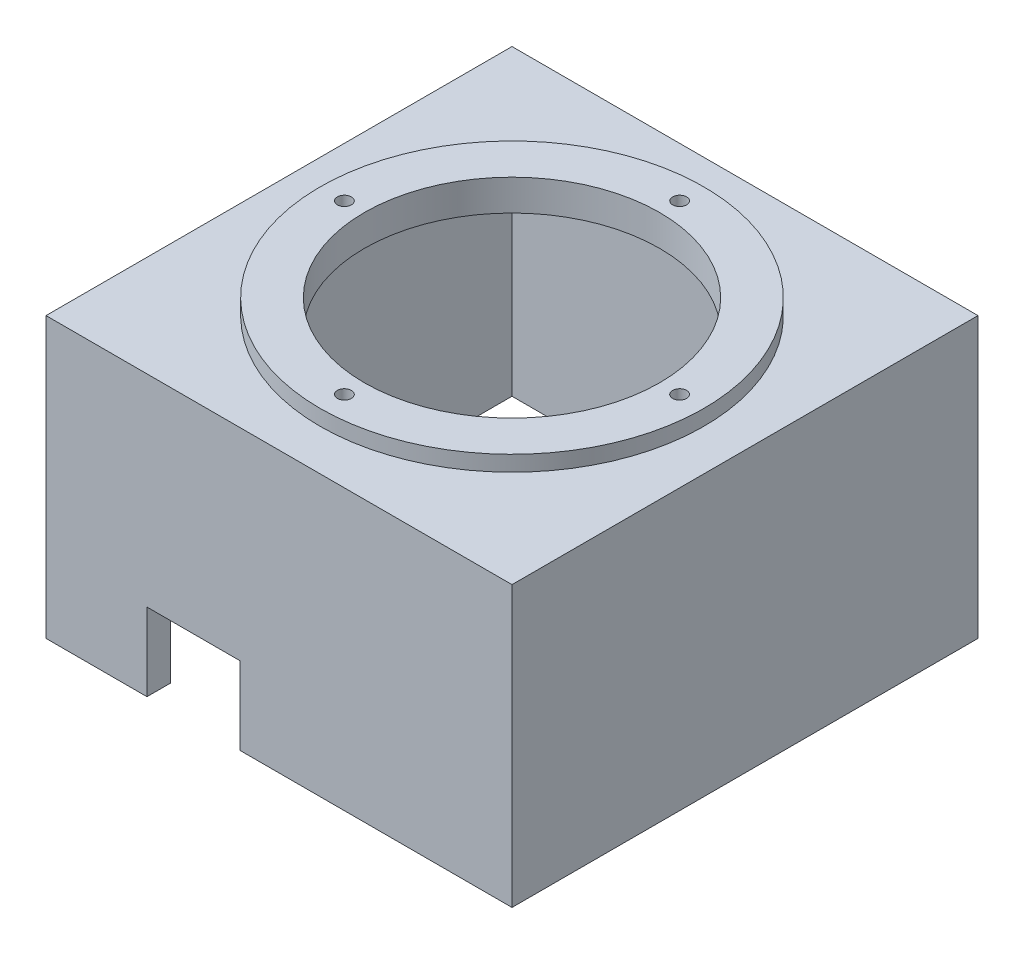
ISO-10303-21;
HEADER;
FILE_DESCRIPTION(('STEP AP214'),'2;1');
FILE_NAME('part.step','',(''),(''),'','','');
FILE_SCHEMA(('AUTOMOTIVE_DESIGN { 1 0 10303 214 1 1 1 1 }'));
ENDSEC;
DATA;
#1=APPLICATION_CONTEXT('core data for automotive mechanical design processes');
#2=APPLICATION_PROTOCOL_DEFINITION('international standard','automotive_design',2000,#1);
#3=PRODUCT_CONTEXT('',#1,'mechanical');
#4=PRODUCT('Part','Part','',(#3));
#5=PRODUCT_RELATED_PRODUCT_CATEGORY('part','',(#4));
#6=PRODUCT_DEFINITION_FORMATION('','',#4);
#7=PRODUCT_DEFINITION_CONTEXT('part definition',#1,'design');
#8=PRODUCT_DEFINITION('design','',#6,#7);
#9=PRODUCT_DEFINITION_SHAPE('','',#8);
#10=(LENGTH_UNIT() NAMED_UNIT(*) SI_UNIT(.MILLI.,.METRE.));
#11=(NAMED_UNIT(*) PLANE_ANGLE_UNIT() SI_UNIT($,.RADIAN.));
#12=(NAMED_UNIT(*) SI_UNIT($,.STERADIAN.) SOLID_ANGLE_UNIT());
#13=UNCERTAINTY_MEASURE_WITH_UNIT(LENGTH_MEASURE(1.E-05),#10,'distance_accuracy_value','');
#14=(GEOMETRIC_REPRESENTATION_CONTEXT(3) GLOBAL_UNCERTAINTY_ASSIGNED_CONTEXT((#13)) GLOBAL_UNIT_ASSIGNED_CONTEXT((#10,
#11,#12)) REPRESENTATION_CONTEXT('',''));
#15=CARTESIAN_POINT('',(0.,0.,0.));
#16=DIRECTION('',(0.,0.,1.));
#17=DIRECTION('',(1.,0.,0.));
#18=AXIS2_PLACEMENT_3D('',#15,#16,#17);
#19=CARTESIAN_POINT('',(0.,5.,0.));
#20=DIRECTION('',(0.,-1.,0.));
#21=DIRECTION('',(0.,0.,-1.));
#22=AXIS2_PLACEMENT_3D('',#19,#20,#21);
#23=CYLINDRICAL_SURFACE('',#22,47.5);
#24=CARTESIAN_POINT('',(0.,5.,0.));
#25=DIRECTION('',(0.,1.,0.));
#26=DIRECTION('',(0.,0.,1.));
#27=AXIS2_PLACEMENT_3D('',#24,#25,#26);
#28=CIRCLE('',#27,47.5);
#29=CARTESIAN_POINT('',(0.,5.,47.5));
#30=VERTEX_POINT('',#29);
#31=EDGE_CURVE('E323',#30,#30,#28,.T.);
#32=ORIENTED_EDGE('',*,*,#31,.T.);
#33=EDGE_LOOP('',(#32));
#34=FACE_BOUND('',#33,.T.);
#35=CARTESIAN_POINT('',(0.,-4.99999999999999,0.));
#36=DIRECTION('',(0.,-1.,0.));
#37=DIRECTION('',(0.,0.,-1.));
#38=AXIS2_PLACEMENT_3D('',#35,#36,#37);
#39=CIRCLE('',#38,47.5);
#40=CARTESIAN_POINT('',(0.,-4.99999999999999,-47.5));
#41=VERTEX_POINT('',#40);
#42=EDGE_CURVE('E241',#41,#41,#39,.T.);
#43=ORIENTED_EDGE('',*,*,#42,.T.);
#44=EDGE_LOOP('',(#43));
#45=FACE_BOUND('',#44,.T.);
#46=ADVANCED_FACE('F78',(#34,#45),#23,.F.);
#47=CARTESIAN_POINT('',(-53.95,-4.5,0.));
#48=DIRECTION('',(0.,1.,0.));
#49=DIRECTION('',(0.,0.,1.));
#50=AXIS2_PLACEMENT_3D('',#47,#48,#49);
#51=CYLINDRICAL_SURFACE('',#50,2.25);
#52=CARTESIAN_POINT('',(-53.95,5.,0.));
#53=DIRECTION('',(0.,1.,0.));
#54=DIRECTION('',(0.,0.,-1.));
#55=AXIS2_PLACEMENT_3D('',#52,#53,#54);
#56=CIRCLE('',#55,2.25);
#57=CARTESIAN_POINT('',(-53.95,5.,-2.24999999999999));
#58=VERTEX_POINT('',#57);
#59=EDGE_CURVE('E332',#58,#58,#56,.T.);
#60=ORIENTED_EDGE('',*,*,#59,.T.);
#61=EDGE_LOOP('',(#60));
#62=FACE_BOUND('',#61,.T.);
#63=CARTESIAN_POINT('',(-53.95,-4.99999999999999,0.));
#64=DIRECTION('',(0.,-1.,0.));
#65=DIRECTION('',(0.,0.,-1.));
#66=AXIS2_PLACEMENT_3D('',#63,#64,#65);
#67=CIRCLE('',#66,2.25);
#68=CARTESIAN_POINT('',(-53.95,-4.99999999999999,-2.24999999999999));
#69=VERTEX_POINT('',#68);
#70=EDGE_CURVE('E237',#69,#69,#67,.F.);
#71=ORIENTED_EDGE('',*,*,#70,.F.);
#72=EDGE_LOOP('',(#71));
#73=FACE_BOUND('',#72,.T.);
#74=ADVANCED_FACE('F391',(#62,#73),#51,.F.);
#75=CARTESIAN_POINT('',(53.95,-4.5,0.));
#76=DIRECTION('',(0.,1.,0.));
#77=DIRECTION('',(0.,0.,1.));
#78=AXIS2_PLACEMENT_3D('',#75,#76,#77);
#79=CYLINDRICAL_SURFACE('',#78,2.25);
#80=CARTESIAN_POINT('',(53.95,5.,0.));
#81=DIRECTION('',(0.,1.,0.));
#82=DIRECTION('',(0.,0.,1.));
#83=AXIS2_PLACEMENT_3D('',#80,#81,#82);
#84=CIRCLE('',#83,2.25);
#85=CARTESIAN_POINT('',(53.95,5.,2.25));
#86=VERTEX_POINT('',#85);
#87=EDGE_CURVE('E328',#86,#86,#84,.T.);
#88=ORIENTED_EDGE('',*,*,#87,.T.);
#89=EDGE_LOOP('',(#88));
#90=FACE_BOUND('',#89,.T.);
#91=CARTESIAN_POINT('',(53.95,-4.99999999999999,0.));
#92=DIRECTION('',(0.,-1.,0.));
#93=DIRECTION('',(0.,0.,-1.));
#94=AXIS2_PLACEMENT_3D('',#91,#92,#93);
#95=CIRCLE('',#94,2.25);
#96=CARTESIAN_POINT('',(53.95,-4.99999999999999,-2.25));
#97=VERTEX_POINT('',#96);
#98=EDGE_CURVE('E233',#97,#97,#95,.F.);
#99=ORIENTED_EDGE('',*,*,#98,.F.);
#100=EDGE_LOOP('',(#99));
#101=FACE_BOUND('',#100,.T.);
#102=ADVANCED_FACE('F398',(#90,#101),#79,.F.);
#103=CARTESIAN_POINT('',(0.,-4.5,53.95));
#104=DIRECTION('',(0.,1.,0.));
#105=DIRECTION('',(0.,0.,1.));
#106=AXIS2_PLACEMENT_3D('',#103,#104,#105);
#107=CYLINDRICAL_SURFACE('',#106,2.25);
#108=CARTESIAN_POINT('',(0.,5.,53.95));
#109=DIRECTION('',(0.,1.,0.));
#110=DIRECTION('',(0.,0.,-1.));
#111=AXIS2_PLACEMENT_3D('',#108,#109,#110);
#112=CIRCLE('',#111,2.25);
#113=CARTESIAN_POINT('',(0.,5.,51.7));
#114=VERTEX_POINT('',#113);
#115=EDGE_CURVE('E324',#114,#114,#112,.T.);
#116=ORIENTED_EDGE('',*,*,#115,.T.);
#117=EDGE_LOOP('',(#116));
#118=FACE_BOUND('',#117,.T.);
#119=CARTESIAN_POINT('',(0.,-4.99999999999999,53.95));
#120=DIRECTION('',(0.,-1.,0.));
#121=DIRECTION('',(0.,0.,-1.));
#122=AXIS2_PLACEMENT_3D('',#119,#120,#121);
#123=CIRCLE('',#122,2.25);
#124=CARTESIAN_POINT('',(0.,-4.99999999999999,51.7));
#125=VERTEX_POINT('',#124);
#126=EDGE_CURVE('E229',#125,#125,#123,.F.);
#127=ORIENTED_EDGE('',*,*,#126,.F.);
#128=EDGE_LOOP('',(#127));
#129=FACE_BOUND('',#128,.T.);
#130=ADVANCED_FACE('F413',(#118,#129),#107,.F.);
#131=CARTESIAN_POINT('',(0.,-4.5,-53.95));
#132=DIRECTION('',(0.,1.,0.));
#133=DIRECTION('',(0.,0.,1.));
#134=AXIS2_PLACEMENT_3D('',#131,#132,#133);
#135=CYLINDRICAL_SURFACE('',#134,2.25);
#136=CARTESIAN_POINT('',(0.,5.,-53.95));
#137=DIRECTION('',(0.,1.,0.));
#138=DIRECTION('',(0.,0.,1.));
#139=AXIS2_PLACEMENT_3D('',#136,#137,#138);
#140=CIRCLE('',#139,2.25);
#141=CARTESIAN_POINT('',(0.,5.,-51.7));
#142=VERTEX_POINT('',#141);
#143=EDGE_CURVE('E319',#142,#142,#140,.T.);
#144=ORIENTED_EDGE('',*,*,#143,.T.);
#145=EDGE_LOOP('',(#144));
#146=FACE_BOUND('',#145,.T.);
#147=CARTESIAN_POINT('',(0.,-4.99999999999999,-53.95));
#148=DIRECTION('',(0.,-1.,0.));
#149=DIRECTION('',(0.,0.,-1.));
#150=AXIS2_PLACEMENT_3D('',#147,#148,#149);
#151=CIRCLE('',#150,2.25);
#152=CARTESIAN_POINT('',(0.,-4.99999999999999,-56.2));
#153=VERTEX_POINT('',#152);
#154=EDGE_CURVE('E82',#153,#153,#151,.F.);
#155=ORIENTED_EDGE('',*,*,#154,.F.);
#156=EDGE_LOOP('',(#155));
#157=FACE_BOUND('',#156,.T.);
#158=ADVANCED_FACE('F405',(#146,#157),#135,.F.);
#159=CARTESIAN_POINT('',(0.,5.,0.));
#160=DIRECTION('',(0.,1.,0.));
#161=DIRECTION('',(0.,0.,1.));
#162=AXIS2_PLACEMENT_3D('',#159,#160,#161);
#163=PLANE('',#162);
#164=ORIENTED_EDGE('',*,*,#143,.F.);
#165=EDGE_LOOP('',(#164));
#166=FACE_BOUND('',#165,.T.);
#167=ORIENTED_EDGE('',*,*,#115,.F.);
#168=EDGE_LOOP('',(#167));
#169=FACE_BOUND('',#168,.T.);
#170=ORIENTED_EDGE('',*,*,#87,.F.);
#171=EDGE_LOOP('',(#170));
#172=FACE_BOUND('',#171,.T.);
#173=ORIENTED_EDGE('',*,*,#59,.F.);
#174=EDGE_LOOP('',(#173));
#175=FACE_BOUND('',#174,.T.);
#176=CARTESIAN_POINT('',(0.,5.,0.));
#177=DIRECTION('',(0.,1.,0.));
#178=DIRECTION('',(0.,0.,1.));
#179=AXIS2_PLACEMENT_3D('',#176,#177,#178);
#180=CIRCLE('',#179,61.7650829549725);
#181=CARTESIAN_POINT('',(0.,5.,61.7650829549725));
#182=VERTEX_POINT('',#181);
#183=EDGE_CURVE('E339',#182,#182,#180,.T.);
#184=ORIENTED_EDGE('',*,*,#183,.T.);
#185=EDGE_LOOP('',(#184));
#186=FACE_BOUND('',#185,.T.);
#187=ORIENTED_EDGE('',*,*,#31,.F.);
#188=EDGE_LOOP('',(#187));
#189=FACE_BOUND('',#188,.T.);
#190=ADVANCED_FACE('F403',(#166,#169,#172,#175,#186,#189),#163,.T.);
#191=CARTESIAN_POINT('',(0.,5.,0.));
#192=DIRECTION('',(0.,-1.,0.));
#193=DIRECTION('',(0.,0.,-1.));
#194=AXIS2_PLACEMENT_3D('',#191,#192,#193);
#195=CYLINDRICAL_SURFACE('',#194,61.7650829549725);
#196=ORIENTED_EDGE('',*,*,#183,.F.);
#197=EDGE_LOOP('',(#196));
#198=FACE_BOUND('',#197,.T.);
#199=CARTESIAN_POINT('',(0.,0.,0.));
#200=DIRECTION('',(0.,1.,0.));
#201=DIRECTION('',(0.,0.,1.));
#202=AXIS2_PLACEMENT_3D('',#199,#200,#201);
#203=CIRCLE('',#202,61.7650829549725);
#204=CARTESIAN_POINT('',(0.,0.,61.7650829549725));
#205=VERTEX_POINT('',#204);
#206=EDGE_CURVE('E318',#205,#205,#203,.T.);
#207=ORIENTED_EDGE('',*,*,#206,.T.);
#208=EDGE_LOOP('',(#207));
#209=FACE_BOUND('',#208,.T.);
#210=ADVANCED_FACE('F80',(#198,#209),#195,.T.);
#211=CARTESIAN_POINT('',(0.,-90.,0.));
#212=DIRECTION('',(0.,-1.,0.));
#213=DIRECTION('',(0.,0.,-1.));
#214=AXIS2_PLACEMENT_3D('',#211,#212,#213);
#215=PLANE('',#214);
#216=DIRECTION('',(-1.,0.,0.));
#217=VECTOR('',#216,1.);
#218=CARTESIAN_POINT('',(-67.5,-90.,67.5));
#219=LINE('',#218,#217);
#220=CARTESIAN_POINT('',(67.5,-90.,67.5));
#221=VERTEX_POINT('',#220);
#222=CARTESIAN_POINT('',(-12.5,-90.,67.5));
#223=VERTEX_POINT('',#222);
#224=EDGE_CURVE('E95',#221,#223,#219,.T.);
#225=ORIENTED_EDGE('',*,*,#224,.F.);
#226=DIRECTION('',(0.,0.,1.));
#227=VECTOR('',#226,1.);
#228=CARTESIAN_POINT('',(67.5,-90.,67.5));
#229=LINE('',#228,#227);
#230=CARTESIAN_POINT('',(67.5,-90.,-67.5));
#231=VERTEX_POINT('',#230);
#232=EDGE_CURVE('E175',#231,#221,#229,.T.);
#233=ORIENTED_EDGE('',*,*,#232,.F.);
#234=DIRECTION('',(1.,0.,0.));
#235=VECTOR('',#234,1.);
#236=CARTESIAN_POINT('',(-67.5,-90.,-67.5));
#237=LINE('',#236,#235);
#238=CARTESIAN_POINT('',(-67.5,-90.,-67.5));
#239=VERTEX_POINT('',#238);
#240=EDGE_CURVE('E194',#239,#231,#237,.T.);
#241=ORIENTED_EDGE('',*,*,#240,.F.);
#242=DIRECTION('',(0.,0.,-1.));
#243=VECTOR('',#242,1.);
#244=CARTESIAN_POINT('',(-67.5,-90.,67.5));
#245=LINE('',#244,#243);
#246=CARTESIAN_POINT('',(-67.5,-90.,67.5));
#247=VERTEX_POINT('',#246);
#248=EDGE_CURVE('E198',#247,#239,#245,.T.);
#249=ORIENTED_EDGE('',*,*,#248,.F.);
#250=CARTESIAN_POINT('',(-42.5,-90.,67.5));
#251=VERTEX_POINT('',#250);
#252=EDGE_CURVE('E207',#251,#247,#219,.T.);
#253=ORIENTED_EDGE('',*,*,#252,.F.);
#254=DIRECTION('',(0.,0.,-1.));
#255=VECTOR('',#254,1.);
#256=CARTESIAN_POINT('',(-42.5,-90.,0.));
#257=LINE('',#256,#255);
#258=CARTESIAN_POINT('',(-42.5,-90.,75.));
#259=VERTEX_POINT('',#258);
#260=EDGE_CURVE('E270',#259,#251,#257,.T.);
#261=ORIENTED_EDGE('',*,*,#260,.F.);
#262=DIRECTION('',(-1.,0.,0.));
#263=VECTOR('',#262,1.);
#264=CARTESIAN_POINT('',(-75.,-90.,75.));
#265=LINE('',#264,#263);
#266=CARTESIAN_POINT('',(-75.,-90.,75.));
#267=VERTEX_POINT('',#266);
#268=EDGE_CURVE('E279',#259,#267,#265,.T.);
#269=ORIENTED_EDGE('',*,*,#268,.T.);
#270=DIRECTION('',(0.,0.,-1.));
#271=VECTOR('',#270,1.);
#272=CARTESIAN_POINT('',(-75.,-90.,75.));
#273=LINE('',#272,#271);
#274=CARTESIAN_POINT('',(-75.,-90.,-75.));
#275=VERTEX_POINT('',#274);
#276=EDGE_CURVE('E285',#267,#275,#273,.T.);
#277=ORIENTED_EDGE('',*,*,#276,.T.);
#278=DIRECTION('',(1.,0.,0.));
#279=VECTOR('',#278,1.);
#280=CARTESIAN_POINT('',(-75.,-90.,-75.));
#281=LINE('',#280,#279);
#282=CARTESIAN_POINT('',(75.,-90.,-75.));
#283=VERTEX_POINT('',#282);
#284=EDGE_CURVE('E288',#275,#283,#281,.T.);
#285=ORIENTED_EDGE('',*,*,#284,.T.);
#286=DIRECTION('',(0.,0.,1.));
#287=VECTOR('',#286,1.);
#288=CARTESIAN_POINT('',(75.,-90.,75.));
#289=LINE('',#288,#287);
#290=CARTESIAN_POINT('',(75.,-90.,75.));
#291=VERTEX_POINT('',#290);
#292=EDGE_CURVE('E275',#283,#291,#289,.T.);
#293=ORIENTED_EDGE('',*,*,#292,.T.);
#294=CARTESIAN_POINT('',(-12.5,-90.,75.));
#295=VERTEX_POINT('',#294);
#296=EDGE_CURVE('E281',#291,#295,#265,.T.);
#297=ORIENTED_EDGE('',*,*,#296,.T.);
#298=DIRECTION('',(0.,0.,1.));
#299=VECTOR('',#298,1.);
#300=CARTESIAN_POINT('',(-12.5,-90.,0.));
#301=LINE('',#300,#299);
#302=EDGE_CURVE('E101',#223,#295,#301,.T.);
#303=ORIENTED_EDGE('',*,*,#302,.F.);
#304=EDGE_LOOP('',(#225,#233,#241,#249,#253,#261,#269,#277,#285,#293,#297,#303));
#305=FACE_BOUND('',#304,.T.);
#306=ADVANCED_FACE('F360',(#305),#215,.T.);
#307=CARTESIAN_POINT('',(0.,0.,0.));
#308=DIRECTION('',(0.,-1.,0.));
#309=DIRECTION('',(0.,0.,-1.));
#310=AXIS2_PLACEMENT_3D('',#307,#308,#309);
#311=PLANE('',#310);
#312=ORIENTED_EDGE('',*,*,#206,.F.);
#313=EDGE_LOOP('',(#312));
#314=FACE_BOUND('',#313,.T.);
#315=DIRECTION('',(0.,0.,1.));
#316=VECTOR('',#315,1.);
#317=CARTESIAN_POINT('',(75.,0.,75.));
#318=LINE('',#317,#316);
#319=CARTESIAN_POINT('',(75.,0.,-75.));
#320=VERTEX_POINT('',#319);
#321=CARTESIAN_POINT('',(75.,0.,75.));
#322=VERTEX_POINT('',#321);
#323=EDGE_CURVE('E274',#320,#322,#318,.T.);
#324=ORIENTED_EDGE('',*,*,#323,.F.);
#325=DIRECTION('',(1.,0.,0.));
#326=VECTOR('',#325,1.);
#327=CARTESIAN_POINT('',(-75.,0.,-75.));
#328=LINE('',#327,#326);
#329=CARTESIAN_POINT('',(-75.,0.,-75.));
#330=VERTEX_POINT('',#329);
#331=EDGE_CURVE('E280',#330,#320,#328,.T.);
#332=ORIENTED_EDGE('',*,*,#331,.F.);
#333=DIRECTION('',(0.,0.,-1.));
#334=VECTOR('',#333,1.);
#335=CARTESIAN_POINT('',(-75.,0.,75.));
#336=LINE('',#335,#334);
#337=CARTESIAN_POINT('',(-75.,0.,75.));
#338=VERTEX_POINT('',#337);
#339=EDGE_CURVE('E298',#338,#330,#336,.T.);
#340=ORIENTED_EDGE('',*,*,#339,.F.);
#341=DIRECTION('',(-1.,0.,0.));
#342=VECTOR('',#341,1.);
#343=CARTESIAN_POINT('',(-75.,0.,75.));
#344=LINE('',#343,#342);
#345=EDGE_CURVE('E295',#322,#338,#344,.T.);
#346=ORIENTED_EDGE('',*,*,#345,.F.);
#347=EDGE_LOOP('',(#324,#332,#340,#346));
#348=FACE_BOUND('',#347,.T.);
#349=ADVANCED_FACE('F430',(#314,#348),#311,.F.);
#350=CARTESIAN_POINT('',(75.,-90.,75.));
#351=DIRECTION('',(-1.,0.,0.));
#352=DIRECTION('',(0.,0.,1.));
#353=AXIS2_PLACEMENT_3D('',#350,#351,#352);
#354=PLANE('',#353);
#355=ORIENTED_EDGE('',*,*,#323,.T.);
#356=DIRECTION('',(0.,1.,0.));
#357=VECTOR('',#356,1.);
#358=CARTESIAN_POINT('',(75.,-90.,75.));
#359=LINE('',#358,#357);
#360=EDGE_CURVE('E314',#291,#322,#359,.T.);
#361=ORIENTED_EDGE('',*,*,#360,.F.);
#362=ORIENTED_EDGE('',*,*,#292,.F.);
#363=DIRECTION('',(0.,1.,0.));
#364=VECTOR('',#363,1.);
#365=CARTESIAN_POINT('',(75.,-90.,-75.));
#366=LINE('',#365,#364);
#367=EDGE_CURVE('E291',#283,#320,#366,.T.);
#368=ORIENTED_EDGE('',*,*,#367,.T.);
#369=EDGE_LOOP('',(#355,#361,#362,#368));
#370=FACE_BOUND('',#369,.T.);
#371=ADVANCED_FACE('F432',(#370),#354,.F.);
#372=CARTESIAN_POINT('',(-75.,-90.,75.));
#373=DIRECTION('',(0.,0.,-1.));
#374=DIRECTION('',(-1.,0.,0.));
#375=AXIS2_PLACEMENT_3D('',#372,#373,#374);
#376=PLANE('',#375);
#377=ORIENTED_EDGE('',*,*,#268,.F.);
#378=DIRECTION('',(0.,1.,0.));
#379=VECTOR('',#378,1.);
#380=CARTESIAN_POINT('',(-42.5,-90.,75.));
#381=LINE('',#380,#379);
#382=CARTESIAN_POINT('',(-42.5,-65.,75.));
#383=VERTEX_POINT('',#382);
#384=EDGE_CURVE('E88',#259,#383,#381,.T.);
#385=ORIENTED_EDGE('',*,*,#384,.T.);
#386=DIRECTION('',(1.,0.,0.));
#387=VECTOR('',#386,1.);
#388=CARTESIAN_POINT('',(-42.5,-65.,75.));
#389=LINE('',#388,#387);
#390=CARTESIAN_POINT('',(-12.5,-65.,75.));
#391=VERTEX_POINT('',#390);
#392=EDGE_CURVE('E251',#383,#391,#389,.T.);
#393=ORIENTED_EDGE('',*,*,#392,.T.);
#394=DIRECTION('',(0.,-1.,0.));
#395=VECTOR('',#394,1.);
#396=CARTESIAN_POINT('',(-12.5,-65.,75.));
#397=LINE('',#396,#395);
#398=EDGE_CURVE('E250',#391,#295,#397,.T.);
#399=ORIENTED_EDGE('',*,*,#398,.T.);
#400=ORIENTED_EDGE('',*,*,#296,.F.);
#401=ORIENTED_EDGE('',*,*,#360,.T.);
#402=ORIENTED_EDGE('',*,*,#345,.T.);
#403=DIRECTION('',(0.,1.,0.));
#404=VECTOR('',#403,1.);
#405=CARTESIAN_POINT('',(-75.,-90.,75.));
#406=LINE('',#405,#404);
#407=EDGE_CURVE('E310',#267,#338,#406,.T.);
#408=ORIENTED_EDGE('',*,*,#407,.F.);
#409=EDGE_LOOP('',(#377,#385,#393,#399,#400,#401,#402,#408));
#410=FACE_BOUND('',#409,.T.);
#411=ADVANCED_FACE('F352',(#410),#376,.F.);
#412=CARTESIAN_POINT('',(-75.,-90.,75.));
#413=DIRECTION('',(1.,0.,0.));
#414=DIRECTION('',(0.,0.,-1.));
#415=AXIS2_PLACEMENT_3D('',#412,#413,#414);
#416=PLANE('',#415);
#417=ORIENTED_EDGE('',*,*,#339,.T.);
#418=DIRECTION('',(0.,1.,0.));
#419=VECTOR('',#418,1.);
#420=CARTESIAN_POINT('',(-75.,-90.,-75.));
#421=LINE('',#420,#419);
#422=EDGE_CURVE('E306',#275,#330,#421,.T.);
#423=ORIENTED_EDGE('',*,*,#422,.F.);
#424=ORIENTED_EDGE('',*,*,#276,.F.);
#425=ORIENTED_EDGE('',*,*,#407,.T.);
#426=EDGE_LOOP('',(#417,#423,#424,#425));
#427=FACE_BOUND('',#426,.T.);
#428=ADVANCED_FACE('F383',(#427),#416,.F.);
#429=CARTESIAN_POINT('',(-75.,-90.,-75.));
#430=DIRECTION('',(0.,0.,1.));
#431=DIRECTION('',(1.,0.,0.));
#432=AXIS2_PLACEMENT_3D('',#429,#430,#431);
#433=PLANE('',#432);
#434=ORIENTED_EDGE('',*,*,#331,.T.);
#435=ORIENTED_EDGE('',*,*,#367,.F.);
#436=ORIENTED_EDGE('',*,*,#284,.F.);
#437=ORIENTED_EDGE('',*,*,#422,.T.);
#438=EDGE_LOOP('',(#434,#435,#436,#437));
#439=FACE_BOUND('',#438,.T.);
#440=ADVANCED_FACE('F375',(#439),#433,.F.);
#441=CARTESIAN_POINT('',(-42.5,-65.,75.));
#442=DIRECTION('',(0.,1.,0.));
#443=DIRECTION('',(0.,0.,1.));
#444=AXIS2_PLACEMENT_3D('',#441,#442,#443);
#445=PLANE('',#444);
#446=DIRECTION('',(0.,0.,-1.));
#447=VECTOR('',#446,1.);
#448=CARTESIAN_POINT('',(-42.5,-65.,75.));
#449=LINE('',#448,#447);
#450=CARTESIAN_POINT('',(-42.5,-65.,67.5));
#451=VERTEX_POINT('',#450);
#452=EDGE_CURVE('E245',#383,#451,#449,.T.);
#453=ORIENTED_EDGE('',*,*,#452,.T.);
#454=DIRECTION('',(1.,0.,0.));
#455=VECTOR('',#454,1.);
#456=CARTESIAN_POINT('',(-42.5,-65.,67.5));
#457=LINE('',#456,#455);
#458=CARTESIAN_POINT('',(-12.5,-65.,67.5));
#459=VERTEX_POINT('',#458);
#460=EDGE_CURVE('E216',#451,#459,#457,.T.);
#461=ORIENTED_EDGE('',*,*,#460,.T.);
#462=DIRECTION('',(0.,0.,-1.));
#463=VECTOR('',#462,1.);
#464=CARTESIAN_POINT('',(-12.5,-65.,75.));
#465=LINE('',#464,#463);
#466=EDGE_CURVE('E246',#391,#459,#465,.T.);
#467=ORIENTED_EDGE('',*,*,#466,.F.);
#468=ORIENTED_EDGE('',*,*,#392,.F.);
#469=EDGE_LOOP('',(#453,#461,#467,#468));
#470=FACE_BOUND('',#469,.T.);
#471=ADVANCED_FACE('F373',(#470),#445,.F.);
#472=CARTESIAN_POINT('',(-42.5,-65.,75.));
#473=DIRECTION('',(-1.,0.,0.));
#474=DIRECTION('',(0.,0.,1.));
#475=AXIS2_PLACEMENT_3D('',#472,#473,#474);
#476=PLANE('',#475);
#477=ORIENTED_EDGE('',*,*,#260,.T.);
#478=DIRECTION('',(0.,1.,0.));
#479=VECTOR('',#478,1.);
#480=CARTESIAN_POINT('',(-42.5,-65.,67.5));
#481=LINE('',#480,#479);
#482=EDGE_CURVE('E225',#251,#451,#481,.T.);
#483=ORIENTED_EDGE('',*,*,#482,.T.);
#484=ORIENTED_EDGE('',*,*,#452,.F.);
#485=ORIENTED_EDGE('',*,*,#384,.F.);
#486=EDGE_LOOP('',(#477,#483,#484,#485));
#487=FACE_BOUND('',#486,.T.);
#488=ADVANCED_FACE('F357',(#487),#476,.F.);
#489=CARTESIAN_POINT('',(-12.5,-65.,75.));
#490=DIRECTION('',(1.,0.,0.));
#491=DIRECTION('',(0.,0.,-1.));
#492=AXIS2_PLACEMENT_3D('',#489,#490,#491);
#493=PLANE('',#492);
#494=ORIENTED_EDGE('',*,*,#466,.T.);
#495=DIRECTION('',(0.,-1.,0.));
#496=VECTOR('',#495,1.);
#497=CARTESIAN_POINT('',(-12.5,-65.,67.5));
#498=LINE('',#497,#496);
#499=EDGE_CURVE('E12',#459,#223,#498,.T.);
#500=ORIENTED_EDGE('',*,*,#499,.T.);
#501=ORIENTED_EDGE('',*,*,#302,.T.);
#502=ORIENTED_EDGE('',*,*,#398,.F.);
#503=EDGE_LOOP('',(#494,#500,#501,#502));
#504=FACE_BOUND('',#503,.T.);
#505=ADVANCED_FACE('F371',(#504),#493,.F.);
#506=CARTESIAN_POINT('',(0.,-4.99999999999999,0.));
#507=DIRECTION('',(0.,-1.,0.));
#508=DIRECTION('',(0.,0.,-1.));
#509=AXIS2_PLACEMENT_3D('',#506,#507,#508);
#510=PLANE('',#509);
#511=ORIENTED_EDGE('',*,*,#42,.F.);
#512=EDGE_LOOP('',(#511));
#513=FACE_BOUND('',#512,.T.);
#514=DIRECTION('',(0.,0.,1.));
#515=VECTOR('',#514,1.);
#516=CARTESIAN_POINT('',(67.5,-4.99999999999999,67.5));
#517=LINE('',#516,#515);
#518=CARTESIAN_POINT('',(67.5,-4.99999999999999,-67.5));
#519=VERTEX_POINT('',#518);
#520=CARTESIAN_POINT('',(67.5,-4.99999999999999,67.5));
#521=VERTEX_POINT('',#520);
#522=EDGE_CURVE('E172',#519,#521,#517,.T.);
#523=ORIENTED_EDGE('',*,*,#522,.T.);
#524=DIRECTION('',(-1.,0.,0.));
#525=VECTOR('',#524,1.);
#526=CARTESIAN_POINT('',(-67.5,-4.99999999999999,67.5));
#527=LINE('',#526,#525);
#528=CARTESIAN_POINT('',(-67.5,-4.99999999999999,67.5));
#529=VERTEX_POINT('',#528);
#530=EDGE_CURVE('E181',#521,#529,#527,.T.);
#531=ORIENTED_EDGE('',*,*,#530,.T.);
#532=DIRECTION('',(0.,0.,-1.));
#533=VECTOR('',#532,1.);
#534=CARTESIAN_POINT('',(-67.5,-4.99999999999999,67.5));
#535=LINE('',#534,#533);
#536=CARTESIAN_POINT('',(-67.5,-4.99999999999999,-67.5));
#537=VERTEX_POINT('',#536);
#538=EDGE_CURVE('E188',#529,#537,#535,.T.);
#539=ORIENTED_EDGE('',*,*,#538,.T.);
#540=DIRECTION('',(1.,0.,0.));
#541=VECTOR('',#540,1.);
#542=CARTESIAN_POINT('',(-67.5,-4.99999999999999,-67.5));
#543=LINE('',#542,#541);
#544=EDGE_CURVE('E178',#537,#519,#543,.T.);
#545=ORIENTED_EDGE('',*,*,#544,.T.);
#546=EDGE_LOOP('',(#523,#531,#539,#545));
#547=FACE_BOUND('',#546,.T.);
#548=ORIENTED_EDGE('',*,*,#154,.T.);
#549=EDGE_LOOP('',(#548));
#550=FACE_BOUND('',#549,.T.);
#551=ORIENTED_EDGE('',*,*,#126,.T.);
#552=EDGE_LOOP('',(#551));
#553=FACE_BOUND('',#552,.T.);
#554=ORIENTED_EDGE('',*,*,#98,.T.);
#555=EDGE_LOOP('',(#554));
#556=FACE_BOUND('',#555,.T.);
#557=ORIENTED_EDGE('',*,*,#70,.T.);
#558=EDGE_LOOP('',(#557));
#559=FACE_BOUND('',#558,.T.);
#560=ADVANCED_FACE('F190',(#513,#547,#550,#553,#556,#559),#510,.T.);
#561=CARTESIAN_POINT('',(-67.5,-4.99999999999999,67.5));
#562=DIRECTION('',(0.,0.,1.));
#563=DIRECTION('',(1.,0.,0.));
#564=AXIS2_PLACEMENT_3D('',#561,#562,#563);
#565=PLANE('',#564);
#566=ORIENTED_EDGE('',*,*,#252,.T.);
#567=DIRECTION('',(0.,-1.,0.));
#568=VECTOR('',#567,1.);
#569=CARTESIAN_POINT('',(-67.5,-4.99999999999999,67.5));
#570=LINE('',#569,#568);
#571=EDGE_CURVE('E177',#529,#247,#570,.T.);
#572=ORIENTED_EDGE('',*,*,#571,.F.);
#573=ORIENTED_EDGE('',*,*,#530,.F.);
#574=DIRECTION('',(0.,-1.,0.));
#575=VECTOR('',#574,1.);
#576=CARTESIAN_POINT('',(67.5,-4.99999999999999,67.5));
#577=LINE('',#576,#575);
#578=EDGE_CURVE('E168',#521,#221,#577,.T.);
#579=ORIENTED_EDGE('',*,*,#578,.T.);
#580=ORIENTED_EDGE('',*,*,#224,.T.);
#581=ORIENTED_EDGE('',*,*,#499,.F.);
#582=ORIENTED_EDGE('',*,*,#460,.F.);
#583=ORIENTED_EDGE('',*,*,#482,.F.);
#584=EDGE_LOOP('',(#566,#572,#573,#579,#580,#581,#582,#583));
#585=FACE_BOUND('',#584,.T.);
#586=ADVANCED_FACE('F182',(#585),#565,.F.);
#587=CARTESIAN_POINT('',(67.5,-4.99999999999999,67.5));
#588=DIRECTION('',(1.,0.,0.));
#589=DIRECTION('',(0.,0.,-1.));
#590=AXIS2_PLACEMENT_3D('',#587,#588,#589);
#591=PLANE('',#590);
#592=ORIENTED_EDGE('',*,*,#232,.T.);
#593=ORIENTED_EDGE('',*,*,#578,.F.);
#594=ORIENTED_EDGE('',*,*,#522,.F.);
#595=DIRECTION('',(0.,-1.,0.));
#596=VECTOR('',#595,1.);
#597=CARTESIAN_POINT('',(67.5,-4.99999999999999,-67.5));
#598=LINE('',#597,#596);
#599=EDGE_CURVE('E213',#519,#231,#598,.T.);
#600=ORIENTED_EDGE('',*,*,#599,.T.);
#601=EDGE_LOOP('',(#592,#593,#594,#600));
#602=FACE_BOUND('',#601,.T.);
#603=ADVANCED_FACE('F170',(#602),#591,.F.);
#604=CARTESIAN_POINT('',(-67.5,-4.99999999999999,-67.5));
#605=DIRECTION('',(0.,0.,-1.));
#606=DIRECTION('',(-1.,0.,0.));
#607=AXIS2_PLACEMENT_3D('',#604,#605,#606);
#608=PLANE('',#607);
#609=ORIENTED_EDGE('',*,*,#240,.T.);
#610=ORIENTED_EDGE('',*,*,#599,.F.);
#611=ORIENTED_EDGE('',*,*,#544,.F.);
#612=DIRECTION('',(0.,-1.,0.));
#613=VECTOR('',#612,1.);
#614=CARTESIAN_POINT('',(-67.5,-4.99999999999999,-67.5));
#615=LINE('',#614,#613);
#616=EDGE_CURVE('E217',#537,#239,#615,.T.);
#617=ORIENTED_EDGE('',*,*,#616,.T.);
#618=EDGE_LOOP('',(#609,#610,#611,#617));
#619=FACE_BOUND('',#618,.T.);
#620=ADVANCED_FACE('F367',(#619),#608,.F.);
#621=CARTESIAN_POINT('',(-67.5,-4.99999999999999,67.5));
#622=DIRECTION('',(-1.,0.,0.));
#623=DIRECTION('',(0.,0.,1.));
#624=AXIS2_PLACEMENT_3D('',#621,#622,#623);
#625=PLANE('',#624);
#626=ORIENTED_EDGE('',*,*,#248,.T.);
#627=ORIENTED_EDGE('',*,*,#616,.F.);
#628=ORIENTED_EDGE('',*,*,#538,.F.);
#629=ORIENTED_EDGE('',*,*,#571,.T.);
#630=EDGE_LOOP('',(#626,#627,#628,#629));
#631=FACE_BOUND('',#630,.T.);
#632=ADVANCED_FACE('F365',(#631),#625,.F.);
#633=CLOSED_SHELL('',(#46,#74,#102,#130,#158,#190,#210,#306,#349,#371,#411,#428,#440,#471,#488,
#505,#560,#586,#603,#620,#632));
#634=MANIFOLD_SOLID_BREP('B2',#633);
#635=ADVANCED_BREP_SHAPE_REPRESENTATION('',(#18,#634),#14);
#636=SHAPE_DEFINITION_REPRESENTATION(#9,#635);
ENDSEC;
END-ISO-10303-21;
